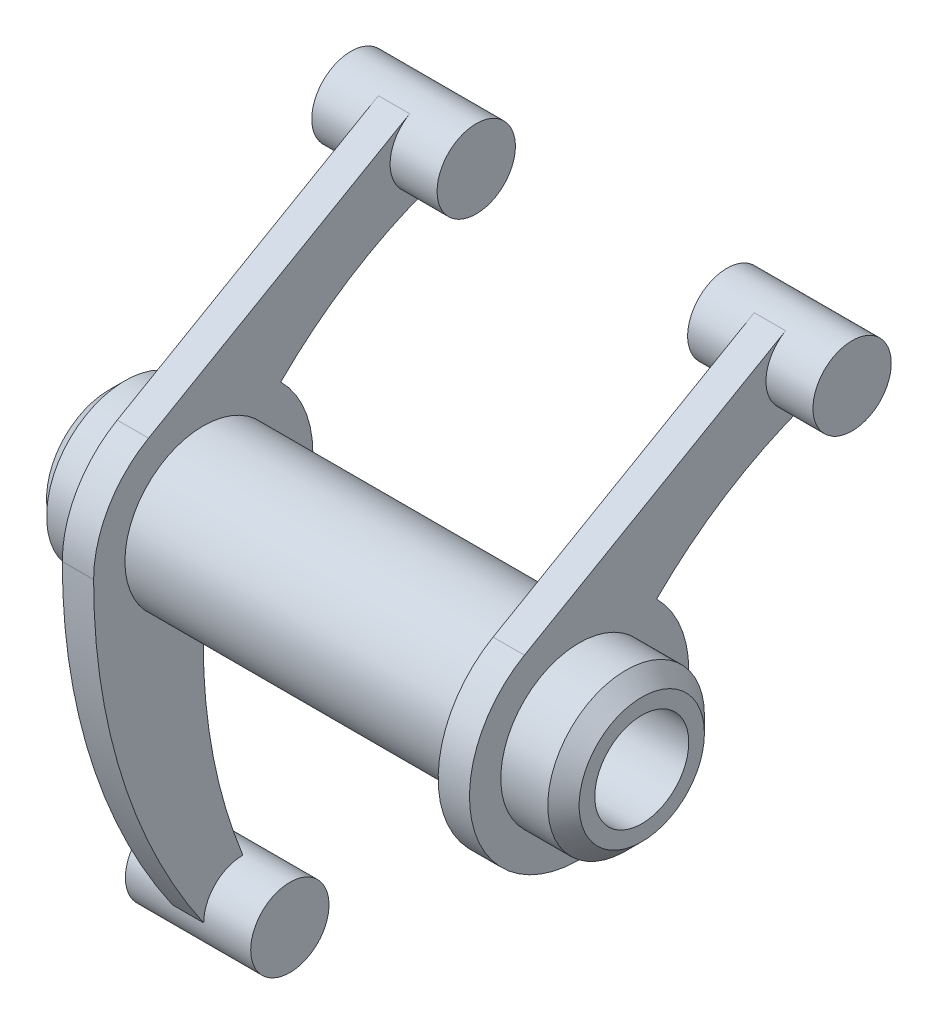
ISO-10303-21;
HEADER;
FILE_DESCRIPTION(('STEP AP214'),'2;1');
FILE_NAME('part.step','',(''),(''),'','','');
FILE_SCHEMA(('AUTOMOTIVE_DESIGN { 1 0 10303 214 1 1 1 1 }'));
ENDSEC;
DATA;
#1=APPLICATION_CONTEXT('core data for automotive mechanical design processes');
#2=APPLICATION_PROTOCOL_DEFINITION('international standard','automotive_design',2000,#1);
#3=PRODUCT_CONTEXT('',#1,'mechanical');
#4=PRODUCT('Part','Part','',(#3));
#5=PRODUCT_RELATED_PRODUCT_CATEGORY('part','',(#4));
#6=PRODUCT_DEFINITION_FORMATION('','',#4);
#7=PRODUCT_DEFINITION_CONTEXT('part definition',#1,'design');
#8=PRODUCT_DEFINITION('design','',#6,#7);
#9=PRODUCT_DEFINITION_SHAPE('','',#8);
#10=(LENGTH_UNIT() NAMED_UNIT(*) SI_UNIT(.MILLI.,.METRE.));
#11=(NAMED_UNIT(*) PLANE_ANGLE_UNIT() SI_UNIT($,.RADIAN.));
#12=(NAMED_UNIT(*) SI_UNIT($,.STERADIAN.) SOLID_ANGLE_UNIT());
#13=UNCERTAINTY_MEASURE_WITH_UNIT(LENGTH_MEASURE(1.E-05),#10,'distance_accuracy_value','');
#14=(GEOMETRIC_REPRESENTATION_CONTEXT(3) GLOBAL_UNCERTAINTY_ASSIGNED_CONTEXT((#13)) GLOBAL_UNIT_ASSIGNED_CONTEXT((#10,
#11,#12)) REPRESENTATION_CONTEXT('',''));
#15=CARTESIAN_POINT('',(0.,0.,0.));
#16=DIRECTION('',(0.,0.,1.));
#17=DIRECTION('',(1.,0.,0.));
#18=AXIS2_PLACEMENT_3D('',#15,#16,#17);
#19=CARTESIAN_POINT('',(-29.,0.,0.));
#20=DIRECTION('',(1.,0.,0.));
#21=DIRECTION('',(0.,0.,-1.));
#22=AXIS2_PLACEMENT_3D('',#19,#20,#21);
#23=CYLINDRICAL_SURFACE('',#22,5.);
#24=CARTESIAN_POINT('',(-1.,0.,0.));
#25=DIRECTION('',(1.,0.,0.));
#26=DIRECTION('',(0.,0.,-1.));
#27=AXIS2_PLACEMENT_3D('',#24,#25,#26);
#28=CIRCLE('',#27,5.);
#29=CARTESIAN_POINT('',(-1.,0.,-5.));
#30=VERTEX_POINT('',#29);
#31=EDGE_CURVE('E217',#30,#30,#28,.T.);
#32=ORIENTED_EDGE('',*,*,#31,.F.);
#33=EDGE_LOOP('',(#32));
#34=FACE_BOUND('',#33,.T.);
#35=CARTESIAN_POINT('',(-23.,0.,0.));
#36=DIRECTION('',(-1.,0.,0.));
#37=DIRECTION('',(0.,0.,1.));
#38=AXIS2_PLACEMENT_3D('',#35,#36,#37);
#39=CIRCLE('',#38,5.);
#40=CARTESIAN_POINT('',(-23.,0.,5.));
#41=VERTEX_POINT('',#40);
#42=EDGE_CURVE('E160',#41,#41,#39,.T.);
#43=ORIENTED_EDGE('',*,*,#42,.F.);
#44=EDGE_LOOP('',(#43));
#45=FACE_BOUND('',#44,.T.);
#46=ADVANCED_FACE('F56',(#34,#45),#23,.T.);
#47=CARTESIAN_POINT('',(4.,13.5,-14.43));
#48=DIRECTION('',(-1.,0.,0.));
#49=DIRECTION('',(0.,0.,1.));
#50=AXIS2_PLACEMENT_3D('',#47,#48,#49);
#51=CYLINDRICAL_SURFACE('',#50,2.5);
#52=CARTESIAN_POINT('',(-4.,13.5,-14.43));
#53=DIRECTION('',(1.,0.,0.));
#54=DIRECTION('',(0.,0.,-1.));
#55=AXIS2_PLACEMENT_3D('',#52,#53,#54);
#56=CIRCLE('',#55,2.5);
#57=CARTESIAN_POINT('',(-4.,13.5,-16.93));
#58=VERTEX_POINT('',#57);
#59=EDGE_CURVE('E251',#58,#58,#56,.T.);
#60=ORIENTED_EDGE('',*,*,#59,.T.);
#61=EDGE_LOOP('',(#60));
#62=FACE_BOUND('',#61,.T.);
#63=CARTESIAN_POINT('',(4.,13.5,-14.43));
#64=DIRECTION('',(1.,0.,0.));
#65=DIRECTION('',(0.,0.,-1.));
#66=AXIS2_PLACEMENT_3D('',#63,#64,#65);
#67=CIRCLE('',#66,2.5);
#68=CARTESIAN_POINT('',(4.,13.5,-16.93));
#69=VERTEX_POINT('',#68);
#70=EDGE_CURVE('E255',#69,#69,#67,.T.);
#71=ORIENTED_EDGE('',*,*,#70,.F.);
#72=EDGE_LOOP('',(#71));
#73=FACE_BOUND('',#72,.T.);
#74=DIRECTION('',(-1.,0.,0.));
#75=VECTOR('',#74,1.);
#76=CARTESIAN_POINT('',(1.,15.6665985248567,-13.1826625027328));
#77=LINE('',#76,#75);
#78=CARTESIAN_POINT('',(1.,15.6665985248567,-13.1826625027328));
#79=VERTEX_POINT('',#78);
#80=CARTESIAN_POINT('',(-1.,15.6665985248567,-13.1826625027328));
#81=VERTEX_POINT('',#80);
#82=EDGE_CURVE('E73',#79,#81,#77,.T.);
#83=ORIENTED_EDGE('',*,*,#82,.F.);
#84=CARTESIAN_POINT('',(1.,13.5,-14.43));
#85=DIRECTION('',(1.,0.,0.));
#86=DIRECTION('',(0.,0.,-1.));
#87=AXIS2_PLACEMENT_3D('',#84,#85,#86);
#88=CIRCLE('',#87,2.5);
#89=CARTESIAN_POINT('',(1.,11.,-14.43));
#90=VERTEX_POINT('',#89);
#91=EDGE_CURVE('E78',#79,#90,#88,.T.);
#92=ORIENTED_EDGE('',*,*,#91,.T.);
#93=DIRECTION('',(-1.,0.,0.));
#94=VECTOR('',#93,1.);
#95=CARTESIAN_POINT('',(1.,11.,-14.43));
#96=LINE('',#95,#94);
#97=CARTESIAN_POINT('',(-1.,11.,-14.43));
#98=VERTEX_POINT('',#97);
#99=EDGE_CURVE('E247',#90,#98,#96,.T.);
#100=ORIENTED_EDGE('',*,*,#99,.T.);
#101=CARTESIAN_POINT('',(-1.,13.5,-14.43));
#102=DIRECTION('',(1.,0.,0.));
#103=DIRECTION('',(0.,0.,-1.));
#104=AXIS2_PLACEMENT_3D('',#101,#102,#103);
#105=CIRCLE('',#104,2.5);
#106=EDGE_CURVE('E241',#81,#98,#105,.T.);
#107=ORIENTED_EDGE('',*,*,#106,.F.);
#108=EDGE_LOOP('',(#83,#92,#100,#107));
#109=FACE_BOUND('',#108,.T.);
#110=ADVANCED_FACE('F282',(#62,#73,#109),#51,.T.);
#111=CARTESIAN_POINT('',(4.,0.,0.));
#112=DIRECTION('',(1.,0.,0.));
#113=DIRECTION('',(0.,0.,-1.));
#114=AXIS2_PLACEMENT_3D('',#111,#112,#113);
#115=PLANE('',#114);
#116=ORIENTED_EDGE('',*,*,#70,.T.);
#117=EDGE_LOOP('',(#116));
#118=FACE_BOUND('',#117,.T.);
#119=ADVANCED_FACE('F291',(#118),#115,.T.);
#120=CARTESIAN_POINT('',(-4.,0.,0.));
#121=DIRECTION('',(1.,0.,0.));
#122=DIRECTION('',(0.,0.,-1.));
#123=AXIS2_PLACEMENT_3D('',#120,#121,#122);
#124=PLANE('',#123);
#125=ORIENTED_EDGE('',*,*,#59,.F.);
#126=EDGE_LOOP('',(#125));
#127=FACE_BOUND('',#126,.T.);
#128=ADVANCED_FACE('F342',(#127),#124,.F.);
#129=CARTESIAN_POINT('',(1.,0.,0.));
#130=DIRECTION('',(-1.,0.,0.));
#131=DIRECTION('',(0.,0.,1.));
#132=AXIS2_PLACEMENT_3D('',#129,#130,#131);
#133=CYLINDRICAL_SURFACE('',#132,7.);
#134=CARTESIAN_POINT('',(-1.,0.,0.));
#135=DIRECTION('',(1.,0.,0.));
#136=DIRECTION('',(0.,0.,-1.));
#137=AXIS2_PLACEMENT_3D('',#134,#135,#136);
#138=CIRCLE('',#137,7.);
#139=CARTESIAN_POINT('',(-1.,6.06647586959877,3.49254499234812));
#140=VERTEX_POINT('',#139);
#141=CARTESIAN_POINT('',(-1.,4.94974746830582,-4.94974746830584));
#142=VERTEX_POINT('',#141);
#143=EDGE_CURVE('E222',#140,#142,#138,.T.);
#144=ORIENTED_EDGE('',*,*,#143,.T.);
#145=DIRECTION('',(-1.,0.,0.));
#146=VECTOR('',#145,1.);
#147=CARTESIAN_POINT('',(1.,4.94974746830582,-4.94974746830584));
#148=LINE('',#147,#146);
#149=CARTESIAN_POINT('',(1.,4.94974746830582,-4.94974746830584));
#150=VERTEX_POINT('',#149);
#151=EDGE_CURVE('E249',#150,#142,#148,.T.);
#152=ORIENTED_EDGE('',*,*,#151,.F.);
#153=CARTESIAN_POINT('',(1.,0.,0.));
#154=DIRECTION('',(1.,0.,0.));
#155=DIRECTION('',(0.,0.,-1.));
#156=AXIS2_PLACEMENT_3D('',#153,#154,#155);
#157=CIRCLE('',#156,7.);
#158=CARTESIAN_POINT('',(1.,6.06647586959877,3.49254499234812));
#159=VERTEX_POINT('',#158);
#160=EDGE_CURVE('E223',#159,#150,#157,.T.);
#161=ORIENTED_EDGE('',*,*,#160,.F.);
#162=DIRECTION('',(-1.,0.,0.));
#163=VECTOR('',#162,1.);
#164=CARTESIAN_POINT('',(1.,6.06647586959877,3.49254499234812));
#165=LINE('',#164,#163);
#166=EDGE_CURVE('E235',#159,#140,#165,.T.);
#167=ORIENTED_EDGE('',*,*,#166,.T.);
#168=EDGE_LOOP('',(#144,#152,#161,#167));
#169=FACE_BOUND('',#168,.T.);
#170=ADVANCED_FACE('F323',(#169),#133,.T.);
#171=CARTESIAN_POINT('',(1.,-13.5010953991257,-23.395736123874));
#172=DIRECTION('',(-1.,0.,0.));
#173=DIRECTION('',(0.,0.,1.));
#174=AXIS2_PLACEMENT_3D('',#171,#172,#173);
#175=CYLINDRICAL_SURFACE('',#174,26.09);
#176=CARTESIAN_POINT('',(-1.,-13.5010953991257,-23.395736123874));
#177=DIRECTION('',(1.,0.,0.));
#178=DIRECTION('',(0.,0.,-1.));
#179=AXIS2_PLACEMENT_3D('',#176,#177,#178);
#180=CIRCLE('',#179,26.09);
#181=EDGE_CURVE('E236',#142,#98,#180,.F.);
#182=ORIENTED_EDGE('',*,*,#181,.T.);
#183=ORIENTED_EDGE('',*,*,#99,.F.);
#184=CARTESIAN_POINT('',(1.,-13.5010953991257,-23.395736123874));
#185=DIRECTION('',(1.,0.,0.));
#186=DIRECTION('',(0.,0.,-1.));
#187=AXIS2_PLACEMENT_3D('',#184,#185,#186);
#188=CIRCLE('',#187,26.09);
#189=EDGE_CURVE('E228',#150,#90,#188,.F.);
#190=ORIENTED_EDGE('',*,*,#189,.F.);
#191=ORIENTED_EDGE('',*,*,#151,.T.);
#192=EDGE_LOOP('',(#182,#183,#190,#191));
#193=FACE_BOUND('',#192,.T.);
#194=ADVANCED_FACE('F326',(#193),#175,.F.);
#195=CARTESIAN_POINT('',(1.,6.06647586959877,3.49254499234812));
#196=DIRECTION('',(0.,0.866639409942681,0.498934998906874));
#197=DIRECTION('',(0.,-0.498934998906874,0.866639409942681));
#198=AXIS2_PLACEMENT_3D('',#195,#196,#197);
#199=PLANE('',#198);
#200=DIRECTION('',(0.,0.498934998906874,-0.866639409942681));
#201=VECTOR('',#200,1.);
#202=CARTESIAN_POINT('',(-1.,6.06647586959877,3.49254499234812));
#203=LINE('',#202,#201);
#204=EDGE_CURVE('E226',#140,#81,#203,.T.);
#205=ORIENTED_EDGE('',*,*,#204,.F.);
#206=ORIENTED_EDGE('',*,*,#166,.F.);
#207=DIRECTION('',(0.,0.498934998906874,-0.866639409942681));
#208=VECTOR('',#207,1.);
#209=CARTESIAN_POINT('',(1.,6.06647586959877,3.49254499234812));
#210=LINE('',#209,#208);
#211=EDGE_CURVE('E232',#159,#79,#210,.T.);
#212=ORIENTED_EDGE('',*,*,#211,.T.);
#213=ORIENTED_EDGE('',*,*,#82,.T.);
#214=EDGE_LOOP('',(#205,#206,#212,#213));
#215=FACE_BOUND('',#214,.T.);
#216=ADVANCED_FACE('F320',(#215),#199,.T.);
#217=CARTESIAN_POINT('',(1.,0.,0.));
#218=DIRECTION('',(1.,0.,0.));
#219=DIRECTION('',(0.,0.,-1.));
#220=AXIS2_PLACEMENT_3D('',#217,#218,#219);
#221=PLANE('',#220);
#222=CARTESIAN_POINT('',(1.,0.,0.));
#223=DIRECTION('',(1.,0.,0.));
#224=DIRECTION('',(0.,0.,-1.));
#225=AXIS2_PLACEMENT_3D('',#222,#223,#224);
#226=CIRCLE('',#225,5.);
#227=CARTESIAN_POINT('',(1.,0.,-5.));
#228=VERTEX_POINT('',#227);
#229=EDGE_CURVE('E225',#228,#228,#226,.T.);
#230=ORIENTED_EDGE('',*,*,#229,.F.);
#231=EDGE_LOOP('',(#230));
#232=FACE_BOUND('',#231,.T.);
#233=ORIENTED_EDGE('',*,*,#160,.T.);
#234=ORIENTED_EDGE('',*,*,#189,.T.);
#235=ORIENTED_EDGE('',*,*,#91,.F.);
#236=ORIENTED_EDGE('',*,*,#211,.F.);
#237=EDGE_LOOP('',(#233,#234,#235,#236));
#238=FACE_BOUND('',#237,.T.);
#239=ADVANCED_FACE('F314',(#232,#238),#221,.T.);
#240=CARTESIAN_POINT('',(-1.,0.,0.));
#241=DIRECTION('',(1.,0.,0.));
#242=DIRECTION('',(0.,0.,-1.));
#243=AXIS2_PLACEMENT_3D('',#240,#241,#242);
#244=PLANE('',#243);
#245=ORIENTED_EDGE('',*,*,#31,.T.);
#246=EDGE_LOOP('',(#245));
#247=FACE_BOUND('',#246,.T.);
#248=ORIENTED_EDGE('',*,*,#143,.F.);
#249=ORIENTED_EDGE('',*,*,#204,.T.);
#250=ORIENTED_EDGE('',*,*,#106,.T.);
#251=ORIENTED_EDGE('',*,*,#181,.F.);
#252=EDGE_LOOP('',(#248,#249,#250,#251));
#253=FACE_BOUND('',#252,.T.);
#254=ADVANCED_FACE('F301',(#247,#253),#244,.F.);
#255=CARTESIAN_POINT('',(-28.,0.,0.));
#256=DIRECTION('',(1.,0.,0.));
#257=DIRECTION('',(0.,0.,-1.));
#258=AXIS2_PLACEMENT_3D('',#255,#256,#257);
#259=CIRCLE('',#258,5.);
#260=CARTESIAN_POINT('',(-28.,0.,-5.));
#261=VERTEX_POINT('',#260);
#262=EDGE_CURVE('E265',#261,#261,#259,.T.);
#263=ORIENTED_EDGE('',*,*,#262,.T.);
#264=EDGE_LOOP('',(#263));
#265=FACE_BOUND('',#264,.T.);
#266=CARTESIAN_POINT('',(-25.,0.,0.));
#267=DIRECTION('',(-1.,0.,0.));
#268=DIRECTION('',(0.,0.,1.));
#269=AXIS2_PLACEMENT_3D('',#266,#267,#268);
#270=CIRCLE('',#269,5.);
#271=CARTESIAN_POINT('',(-25.,0.,5.));
#272=VERTEX_POINT('',#271);
#273=EDGE_CURVE('E260',#272,#272,#270,.F.);
#274=ORIENTED_EDGE('',*,*,#273,.F.);
#275=EDGE_LOOP('',(#274));
#276=FACE_BOUND('',#275,.T.);
#277=ADVANCED_FACE('F286',(#265,#276),#23,.T.);
#278=CARTESIAN_POINT('',(3.99999999999999,0.,0.));
#279=DIRECTION('',(1.,0.,0.));
#280=DIRECTION('',(0.,0.,-1.));
#281=AXIS2_PLACEMENT_3D('',#278,#279,#280);
#282=CIRCLE('',#281,5.);
#283=CARTESIAN_POINT('',(3.99999999999999,0.,-5.));
#284=VERTEX_POINT('',#283);
#285=EDGE_CURVE('E12',#284,#284,#282,.F.);
#286=ORIENTED_EDGE('',*,*,#285,.T.);
#287=EDGE_LOOP('',(#286));
#288=FACE_BOUND('',#287,.T.);
#289=ORIENTED_EDGE('',*,*,#229,.T.);
#290=EDGE_LOOP('',(#289));
#291=FACE_BOUND('',#290,.T.);
#292=ADVANCED_FACE('F287',(#288,#291),#23,.T.);
#293=CARTESIAN_POINT('',(-29.,0.,0.));
#294=DIRECTION('',(1.,0.,0.));
#295=DIRECTION('',(0.,0.,-1.));
#296=AXIS2_PLACEMENT_3D('',#293,#294,#295);
#297=PLANE('',#296);
#298=CARTESIAN_POINT('',(-29.,0.,0.));
#299=DIRECTION('',(1.,0.,0.));
#300=DIRECTION('',(0.,0.,-1.));
#301=AXIS2_PLACEMENT_3D('',#298,#299,#300);
#302=CIRCLE('',#301,3.99999999999998);
#303=CARTESIAN_POINT('',(-29.,0.,-3.99999999999998));
#304=VERTEX_POINT('',#303);
#305=EDGE_CURVE('E264',#304,#304,#302,.F.);
#306=ORIENTED_EDGE('',*,*,#305,.T.);
#307=EDGE_LOOP('',(#306));
#308=FACE_BOUND('',#307,.T.);
#309=CARTESIAN_POINT('',(-29.,0.,0.));
#310=DIRECTION('',(1.,0.,0.));
#311=DIRECTION('',(0.,0.,-1.));
#312=AXIS2_PLACEMENT_3D('',#309,#310,#311);
#313=CIRCLE('',#312,3.);
#314=CARTESIAN_POINT('',(-29.,0.,-3.));
#315=VERTEX_POINT('',#314);
#316=EDGE_CURVE('E214',#315,#315,#313,.T.);
#317=ORIENTED_EDGE('',*,*,#316,.T.);
#318=EDGE_LOOP('',(#317));
#319=FACE_BOUND('',#318,.T.);
#320=ADVANCED_FACE('F303',(#308,#319),#297,.F.);
#321=CARTESIAN_POINT('',(-29.,0.,0.));
#322=DIRECTION('',(1.,0.,0.));
#323=DIRECTION('',(0.,0.,-1.));
#324=AXIS2_PLACEMENT_3D('',#321,#322,#323);
#325=CYLINDRICAL_SURFACE('',#324,3.);
#326=ORIENTED_EDGE('',*,*,#316,.F.);
#327=EDGE_LOOP('',(#326));
#328=FACE_BOUND('',#327,.T.);
#329=CARTESIAN_POINT('',(5.,0.,0.));
#330=DIRECTION('',(1.,0.,0.));
#331=DIRECTION('',(0.,0.,-1.));
#332=AXIS2_PLACEMENT_3D('',#329,#330,#331);
#333=CIRCLE('',#332,3.);
#334=CARTESIAN_POINT('',(5.,0.,-3.));
#335=VERTEX_POINT('',#334);
#336=EDGE_CURVE('E215',#335,#335,#333,.T.);
#337=ORIENTED_EDGE('',*,*,#336,.T.);
#338=EDGE_LOOP('',(#337));
#339=FACE_BOUND('',#338,.T.);
#340=ADVANCED_FACE('F310',(#328,#339),#325,.F.);
#341=CARTESIAN_POINT('',(5.,0.,0.));
#342=DIRECTION('',(1.,0.,0.));
#343=DIRECTION('',(0.,0.,-1.));
#344=AXIS2_PLACEMENT_3D('',#341,#342,#343);
#345=PLANE('',#344);
#346=CARTESIAN_POINT('',(5.,0.,0.));
#347=DIRECTION('',(1.,0.,0.));
#348=DIRECTION('',(0.,0.,-1.));
#349=AXIS2_PLACEMENT_3D('',#346,#347,#348);
#350=CIRCLE('',#349,4.);
#351=CARTESIAN_POINT('',(5.,0.,-4.));
#352=VERTEX_POINT('',#351);
#353=EDGE_CURVE('E69',#352,#352,#350,.T.);
#354=ORIENTED_EDGE('',*,*,#353,.T.);
#355=EDGE_LOOP('',(#354));
#356=FACE_BOUND('',#355,.T.);
#357=ORIENTED_EDGE('',*,*,#336,.F.);
#358=EDGE_LOOP('',(#357));
#359=FACE_BOUND('',#358,.T.);
#360=ADVANCED_FACE('F269',(#356,#359),#345,.T.);
#361=CARTESIAN_POINT('',(-25.,-13.5010953991257,-23.395736123874));
#362=DIRECTION('',(1.,0.,0.));
#363=DIRECTION('',(0.,0.,-1.));
#364=AXIS2_PLACEMENT_3D('',#361,#362,#363);
#365=CYLINDRICAL_SURFACE('',#364,26.09);
#366=CARTESIAN_POINT('',(-23.,-13.5010953991257,-23.395736123874));
#367=DIRECTION('',(-1.,0.,0.));
#368=DIRECTION('',(0.,0.,1.));
#369=AXIS2_PLACEMENT_3D('',#366,#367,#368);
#370=CIRCLE('',#369,26.09);
#371=CARTESIAN_POINT('',(-23.,4.94974746830582,-4.94974746830584));
#372=VERTEX_POINT('',#371);
#373=CARTESIAN_POINT('',(-23.,11.,-14.4299999999999));
#374=VERTEX_POINT('',#373);
#375=EDGE_CURVE('E162',#372,#374,#370,.T.);
#376=ORIENTED_EDGE('',*,*,#375,.F.);
#377=DIRECTION('',(1.,0.,0.));
#378=VECTOR('',#377,1.);
#379=CARTESIAN_POINT('',(-25.,4.94974746830582,-4.94974746830584));
#380=LINE('',#379,#378);
#381=CARTESIAN_POINT('',(-25.,4.94974746830582,-4.94974746830584));
#382=VERTEX_POINT('',#381);
#383=EDGE_CURVE('E209',#382,#372,#380,.T.);
#384=ORIENTED_EDGE('',*,*,#383,.F.);
#385=CARTESIAN_POINT('',(-25.,-13.5010953991257,-23.395736123874));
#386=DIRECTION('',(-1.,0.,0.));
#387=DIRECTION('',(0.,0.,1.));
#388=AXIS2_PLACEMENT_3D('',#385,#386,#387);
#389=CIRCLE('',#388,26.09);
#390=CARTESIAN_POINT('',(-25.,11.,-14.43));
#391=VERTEX_POINT('',#390);
#392=EDGE_CURVE('E164',#382,#391,#389,.T.);
#393=ORIENTED_EDGE('',*,*,#392,.T.);
#394=DIRECTION('',(1.,0.,0.));
#395=VECTOR('',#394,1.);
#396=CARTESIAN_POINT('',(-25.,11.,-14.43));
#397=LINE('',#396,#395);
#398=EDGE_CURVE('E149',#391,#374,#397,.T.);
#399=ORIENTED_EDGE('',*,*,#398,.T.);
#400=EDGE_LOOP('',(#376,#384,#393,#399));
#401=FACE_BOUND('',#400,.T.);
#402=ADVANCED_FACE('F165',(#401),#365,.F.);
#403=CARTESIAN_POINT('',(-25.,0.,0.));
#404=DIRECTION('',(1.,0.,0.));
#405=DIRECTION('',(0.,0.,-1.));
#406=AXIS2_PLACEMENT_3D('',#403,#404,#405);
#407=CYLINDRICAL_SURFACE('',#406,7.);
#408=CARTESIAN_POINT('',(-23.,0.,0.));
#409=DIRECTION('',(-1.,0.,0.));
#410=DIRECTION('',(0.,0.,1.));
#411=AXIS2_PLACEMENT_3D('',#408,#409,#410);
#412=CIRCLE('',#411,7.);
#413=CARTESIAN_POINT('',(-23.,-7.,0.));
#414=VERTEX_POINT('',#413);
#415=EDGE_CURVE('E172',#372,#414,#412,.T.);
#416=ORIENTED_EDGE('',*,*,#415,.T.);
#417=DIRECTION('',(1.,0.,0.));
#418=VECTOR('',#417,1.);
#419=CARTESIAN_POINT('',(-25.,-7.,0.));
#420=LINE('',#419,#418);
#421=CARTESIAN_POINT('',(-25.,-7.,0.));
#422=VERTEX_POINT('',#421);
#423=EDGE_CURVE('E210',#422,#414,#420,.T.);
#424=ORIENTED_EDGE('',*,*,#423,.F.);
#425=CARTESIAN_POINT('',(-25.,0.,0.));
#426=DIRECTION('',(-1.,0.,0.));
#427=DIRECTION('',(0.,0.,1.));
#428=AXIS2_PLACEMENT_3D('',#425,#426,#427);
#429=CIRCLE('',#428,7.);
#430=EDGE_CURVE('E586',#382,#422,#429,.T.);
#431=ORIENTED_EDGE('',*,*,#430,.F.);
#432=ORIENTED_EDGE('',*,*,#383,.T.);
#433=EDGE_LOOP('',(#416,#424,#431,#432));
#434=FACE_BOUND('',#433,.T.);
#435=ADVANCED_FACE('F434',(#434),#407,.T.);
#436=CARTESIAN_POINT('',(-25.,-7.00081923265346,-34.6599999903182));
#437=DIRECTION('',(1.,0.,0.));
#438=DIRECTION('',(0.,0.,-1.));
#439=AXIS2_PLACEMENT_3D('',#436,#437,#438);
#440=CYLINDRICAL_SURFACE('',#439,34.66);
#441=CARTESIAN_POINT('',(-23.,-7.00081923265346,-34.6599999903182));
#442=DIRECTION('',(-1.,0.,0.));
#443=DIRECTION('',(0.,0.,1.));
#444=AXIS2_PLACEMENT_3D('',#441,#442,#443);
#445=CIRCLE('',#444,34.66);
#446=CARTESIAN_POINT('',(-23.,-20.,-2.53));
#447=VERTEX_POINT('',#446);
#448=EDGE_CURVE('E176',#414,#447,#445,.F.);
#449=ORIENTED_EDGE('',*,*,#448,.T.);
#450=DIRECTION('',(1.,0.,0.));
#451=VECTOR('',#450,1.);
#452=CARTESIAN_POINT('',(-25.,-20.,-2.53));
#453=LINE('',#452,#451);
#454=CARTESIAN_POINT('',(-25.,-20.,-2.53));
#455=VERTEX_POINT('',#454);
#456=EDGE_CURVE('E202',#455,#447,#453,.T.);
#457=ORIENTED_EDGE('',*,*,#456,.F.);
#458=CARTESIAN_POINT('',(-25.,-7.00081923265346,-34.6599999903182));
#459=DIRECTION('',(-1.,0.,0.));
#460=DIRECTION('',(0.,0.,1.));
#461=AXIS2_PLACEMENT_3D('',#458,#459,#460);
#462=CIRCLE('',#461,34.66);
#463=EDGE_CURVE('E587',#422,#455,#462,.F.);
#464=ORIENTED_EDGE('',*,*,#463,.F.);
#465=ORIENTED_EDGE('',*,*,#423,.T.);
#466=EDGE_LOOP('',(#449,#457,#464,#465));
#467=FACE_BOUND('',#466,.T.);
#468=ADVANCED_FACE('F443',(#467),#440,.F.);
#469=CARTESIAN_POINT('',(-25.,-0.000437777781714681,-32.5199999970534));
#470=DIRECTION('',(1.,0.,0.));
#471=DIRECTION('',(0.,0.,-1.));
#472=AXIS2_PLACEMENT_3D('',#469,#470,#471);
#473=CYLINDRICAL_SURFACE('',#472,39.52);
#474=CARTESIAN_POINT('',(-23.,-0.000437777781714681,-32.5199999970534));
#475=DIRECTION('',(-1.,0.,0.));
#476=DIRECTION('',(0.,0.,1.));
#477=AXIS2_PLACEMENT_3D('',#474,#475,#476);
#478=CIRCLE('',#477,39.52);
#479=CARTESIAN_POINT('',(-23.,-22.5000000000001,-0.0300000000000508));
#480=VERTEX_POINT('',#479);
#481=CARTESIAN_POINT('',(-23.,9.42326098401834E-05,6.99999999936573));
#482=VERTEX_POINT('',#481);
#483=EDGE_CURVE('E189',#480,#482,#478,.T.);
#484=ORIENTED_EDGE('',*,*,#483,.T.);
#485=DIRECTION('',(1.,0.,0.));
#486=VECTOR('',#485,1.);
#487=CARTESIAN_POINT('',(-25.,9.42326098401834E-05,6.99999999936573));
#488=LINE('',#487,#486);
#489=CARTESIAN_POINT('',(-25.,9.42326098401834E-05,6.99999999936573));
#490=VERTEX_POINT('',#489);
#491=EDGE_CURVE('E200',#490,#482,#488,.T.);
#492=ORIENTED_EDGE('',*,*,#491,.F.);
#493=CARTESIAN_POINT('',(-25.,-0.000437777781714681,-32.5199999970534));
#494=DIRECTION('',(-1.,0.,0.));
#495=DIRECTION('',(0.,0.,1.));
#496=AXIS2_PLACEMENT_3D('',#493,#494,#495);
#497=CIRCLE('',#496,39.52);
#498=CARTESIAN_POINT('',(-25.,-22.5,-0.0300000000000005));
#499=VERTEX_POINT('',#498);
#500=EDGE_CURVE('E596',#499,#490,#497,.T.);
#501=ORIENTED_EDGE('',*,*,#500,.F.);
#502=DIRECTION('',(1.,0.,0.));
#503=VECTOR('',#502,1.);
#504=CARTESIAN_POINT('',(-25.,-22.5,-0.0300000000000005));
#505=LINE('',#504,#503);
#506=EDGE_CURVE('E205',#499,#480,#505,.T.);
#507=ORIENTED_EDGE('',*,*,#506,.T.);
#508=EDGE_LOOP('',(#484,#492,#501,#507));
#509=FACE_BOUND('',#508,.T.);
#510=ADVANCED_FACE('F455',(#509),#473,.T.);
#511=CARTESIAN_POINT('',(-23.,6.06647586959877,3.49254499234812));
#512=VERTEX_POINT('',#511);
#513=EDGE_CURVE('E179',#482,#512,#412,.T.);
#514=ORIENTED_EDGE('',*,*,#513,.T.);
#515=DIRECTION('',(1.,0.,0.));
#516=VECTOR('',#515,1.);
#517=CARTESIAN_POINT('',(-25.,6.06647586959877,3.49254499234812));
#518=LINE('',#517,#516);
#519=CARTESIAN_POINT('',(-25.,6.06647586959877,3.49254499234812));
#520=VERTEX_POINT('',#519);
#521=EDGE_CURVE('E198',#520,#512,#518,.T.);
#522=ORIENTED_EDGE('',*,*,#521,.F.);
#523=EDGE_CURVE('E591',#490,#520,#429,.T.);
#524=ORIENTED_EDGE('',*,*,#523,.F.);
#525=ORIENTED_EDGE('',*,*,#491,.T.);
#526=EDGE_LOOP('',(#514,#522,#524,#525));
#527=FACE_BOUND('',#526,.T.);
#528=ADVANCED_FACE('F447',(#527),#407,.T.);
#529=CARTESIAN_POINT('',(-25.,6.06647586959877,3.49254499234812));
#530=DIRECTION('',(0.,-0.866639409942681,-0.498934998906874));
#531=DIRECTION('',(0.,0.498934998906874,-0.866639409942681));
#532=AXIS2_PLACEMENT_3D('',#529,#530,#531);
#533=PLANE('',#532);
#534=DIRECTION('',(0.,0.498934998906874,-0.866639409942681));
#535=VECTOR('',#534,1.);
#536=CARTESIAN_POINT('',(-23.,6.06647586959877,3.49254499234812));
#537=LINE('',#536,#535);
#538=CARTESIAN_POINT('',(-23.,15.6665985248567,-13.1826625027328));
#539=VERTEX_POINT('',#538);
#540=EDGE_CURVE('E158',#512,#539,#537,.T.);
#541=ORIENTED_EDGE('',*,*,#540,.T.);
#542=DIRECTION('',(1.,0.,0.));
#543=VECTOR('',#542,1.);
#544=CARTESIAN_POINT('',(-25.,15.6665985248567,-13.1826625027328));
#545=LINE('',#544,#543);
#546=CARTESIAN_POINT('',(-25.,15.6665985248567,-13.1826625027328));
#547=VERTEX_POINT('',#546);
#548=EDGE_CURVE('E155',#547,#539,#545,.T.);
#549=ORIENTED_EDGE('',*,*,#548,.F.);
#550=DIRECTION('',(0.,0.498934998906874,-0.866639409942681));
#551=VECTOR('',#550,1.);
#552=CARTESIAN_POINT('',(-25.,6.06647586959877,3.49254499234812));
#553=LINE('',#552,#551);
#554=EDGE_CURVE('E600',#520,#547,#553,.T.);
#555=ORIENTED_EDGE('',*,*,#554,.F.);
#556=ORIENTED_EDGE('',*,*,#521,.T.);
#557=EDGE_LOOP('',(#541,#549,#555,#556));
#558=FACE_BOUND('',#557,.T.);
#559=ADVANCED_FACE('F475',(#558),#533,.F.);
#560=CARTESIAN_POINT('',(-25.,0.,0.));
#561=DIRECTION('',(-1.,0.,0.));
#562=DIRECTION('',(0.,0.,1.));
#563=AXIS2_PLACEMENT_3D('',#560,#561,#562);
#564=PLANE('',#563);
#565=ORIENTED_EDGE('',*,*,#392,.F.);
#566=ORIENTED_EDGE('',*,*,#430,.T.);
#567=ORIENTED_EDGE('',*,*,#463,.T.);
#568=CARTESIAN_POINT('',(-25.,-22.5,-2.53));
#569=DIRECTION('',(-1.,0.,0.));
#570=DIRECTION('',(0.,0.,1.));
#571=AXIS2_PLACEMENT_3D('',#568,#569,#570);
#572=CIRCLE('',#571,2.5);
#573=EDGE_CURVE('E592',#499,#455,#572,.T.);
#574=ORIENTED_EDGE('',*,*,#573,.F.);
#575=ORIENTED_EDGE('',*,*,#500,.T.);
#576=ORIENTED_EDGE('',*,*,#523,.T.);
#577=ORIENTED_EDGE('',*,*,#554,.T.);
#578=CARTESIAN_POINT('',(-25.,13.5,-14.43));
#579=DIRECTION('',(-1.,0.,0.));
#580=DIRECTION('',(0.,0.,1.));
#581=AXIS2_PLACEMENT_3D('',#578,#579,#580);
#582=CIRCLE('',#581,2.5);
#583=EDGE_CURVE('E170',#391,#547,#582,.T.);
#584=ORIENTED_EDGE('',*,*,#583,.F.);
#585=EDGE_LOOP('',(#565,#566,#567,#574,#575,#576,#577,#584));
#586=FACE_BOUND('',#585,.T.);
#587=ORIENTED_EDGE('',*,*,#273,.T.);
#588=EDGE_LOOP('',(#587));
#589=FACE_BOUND('',#588,.T.);
#590=ADVANCED_FACE('F485',(#586,#589),#564,.T.);
#591=CARTESIAN_POINT('',(-23.,0.,0.));
#592=DIRECTION('',(-1.,0.,0.));
#593=DIRECTION('',(0.,0.,1.));
#594=AXIS2_PLACEMENT_3D('',#591,#592,#593);
#595=PLANE('',#594);
#596=ORIENTED_EDGE('',*,*,#375,.T.);
#597=CARTESIAN_POINT('',(-23.,13.5,-14.43));
#598=DIRECTION('',(-1.,0.,0.));
#599=DIRECTION('',(0.,0.,1.));
#600=AXIS2_PLACEMENT_3D('',#597,#598,#599);
#601=CIRCLE('',#600,2.5);
#602=EDGE_CURVE('E148',#374,#539,#601,.T.);
#603=ORIENTED_EDGE('',*,*,#602,.T.);
#604=ORIENTED_EDGE('',*,*,#540,.F.);
#605=ORIENTED_EDGE('',*,*,#513,.F.);
#606=ORIENTED_EDGE('',*,*,#483,.F.);
#607=CARTESIAN_POINT('',(-23.,-22.5,-2.53));
#608=DIRECTION('',(-1.,0.,0.));
#609=DIRECTION('',(0.,0.,1.));
#610=AXIS2_PLACEMENT_3D('',#607,#608,#609);
#611=CIRCLE('',#610,2.5);
#612=EDGE_CURVE('E190',#480,#447,#611,.T.);
#613=ORIENTED_EDGE('',*,*,#612,.T.);
#614=ORIENTED_EDGE('',*,*,#448,.F.);
#615=ORIENTED_EDGE('',*,*,#415,.F.);
#616=EDGE_LOOP('',(#596,#603,#604,#605,#606,#613,#614,#615));
#617=FACE_BOUND('',#616,.T.);
#618=ORIENTED_EDGE('',*,*,#42,.T.);
#619=EDGE_LOOP('',(#618));
#620=FACE_BOUND('',#619,.T.);
#621=ADVANCED_FACE('F168',(#617,#620),#595,.F.);
#622=CARTESIAN_POINT('',(-20.,13.5,-14.43));
#623=DIRECTION('',(-1.,0.,0.));
#624=DIRECTION('',(0.,0.,1.));
#625=AXIS2_PLACEMENT_3D('',#622,#623,#624);
#626=CYLINDRICAL_SURFACE('',#625,2.5);
#627=CARTESIAN_POINT('',(-28.,13.5,-14.43));
#628=DIRECTION('',(-1.,0.,0.));
#629=DIRECTION('',(0.,0.,1.));
#630=AXIS2_PLACEMENT_3D('',#627,#628,#629);
#631=CIRCLE('',#630,2.5);
#632=CARTESIAN_POINT('',(-28.,13.5,-11.93));
#633=VERTEX_POINT('',#632);
#634=EDGE_CURVE('E582',#633,#633,#631,.T.);
#635=ORIENTED_EDGE('',*,*,#634,.F.);
#636=EDGE_LOOP('',(#635));
#637=FACE_BOUND('',#636,.T.);
#638=CARTESIAN_POINT('',(-20.,13.5,-14.43));
#639=DIRECTION('',(-1.,0.,0.));
#640=DIRECTION('',(0.,0.,1.));
#641=AXIS2_PLACEMENT_3D('',#638,#639,#640);
#642=CIRCLE('',#641,2.5);
#643=CARTESIAN_POINT('',(-20.,13.5,-11.93));
#644=VERTEX_POINT('',#643);
#645=EDGE_CURVE('E578',#644,#644,#642,.T.);
#646=ORIENTED_EDGE('',*,*,#645,.T.);
#647=EDGE_LOOP('',(#646));
#648=FACE_BOUND('',#647,.T.);
#649=ORIENTED_EDGE('',*,*,#398,.F.);
#650=ORIENTED_EDGE('',*,*,#583,.T.);
#651=ORIENTED_EDGE('',*,*,#548,.T.);
#652=ORIENTED_EDGE('',*,*,#602,.F.);
#653=EDGE_LOOP('',(#649,#650,#651,#652));
#654=FACE_BOUND('',#653,.T.);
#655=ADVANCED_FACE('F146',(#637,#648,#654),#626,.T.);
#656=CARTESIAN_POINT('',(-20.,0.,0.));
#657=DIRECTION('',(-1.,0.,0.));
#658=DIRECTION('',(0.,0.,1.));
#659=AXIS2_PLACEMENT_3D('',#656,#657,#658);
#660=PLANE('',#659);
#661=ORIENTED_EDGE('',*,*,#645,.F.);
#662=EDGE_LOOP('',(#661));
#663=FACE_BOUND('',#662,.T.);
#664=ADVANCED_FACE('F513',(#663),#660,.F.);
#665=CARTESIAN_POINT('',(-28.,0.,0.));
#666=DIRECTION('',(-1.,0.,0.));
#667=DIRECTION('',(0.,0.,1.));
#668=AXIS2_PLACEMENT_3D('',#665,#666,#667);
#669=PLANE('',#668);
#670=ORIENTED_EDGE('',*,*,#634,.T.);
#671=EDGE_LOOP('',(#670));
#672=FACE_BOUND('',#671,.T.);
#673=ADVANCED_FACE('F524',(#672),#669,.T.);
#674=CARTESIAN_POINT('',(-20.,-22.5,-2.53));
#675=DIRECTION('',(-1.,0.,0.));
#676=DIRECTION('',(0.,0.,1.));
#677=AXIS2_PLACEMENT_3D('',#674,#675,#676);
#678=CYLINDRICAL_SURFACE('',#677,2.5);
#679=ORIENTED_EDGE('',*,*,#506,.F.);
#680=ORIENTED_EDGE('',*,*,#573,.T.);
#681=ORIENTED_EDGE('',*,*,#456,.T.);
#682=ORIENTED_EDGE('',*,*,#612,.F.);
#683=EDGE_LOOP('',(#679,#680,#681,#682));
#684=FACE_BOUND('',#683,.T.);
#685=CARTESIAN_POINT('',(-20.,-22.5,-2.53));
#686=DIRECTION('',(-1.,0.,0.));
#687=DIRECTION('',(0.,0.,1.));
#688=AXIS2_PLACEMENT_3D('',#685,#686,#687);
#689=CIRCLE('',#688,2.5);
#690=CARTESIAN_POINT('',(-20.,-22.5,-0.0300000000000005));
#691=VERTEX_POINT('',#690);
#692=EDGE_CURVE('E173',#691,#691,#689,.T.);
#693=ORIENTED_EDGE('',*,*,#692,.T.);
#694=EDGE_LOOP('',(#693));
#695=FACE_BOUND('',#694,.T.);
#696=CARTESIAN_POINT('',(-28.,-22.5,-2.53));
#697=DIRECTION('',(-1.,0.,0.));
#698=DIRECTION('',(0.,0.,1.));
#699=AXIS2_PLACEMENT_3D('',#696,#697,#698);
#700=CIRCLE('',#699,2.5);
#701=CARTESIAN_POINT('',(-28.,-22.5,-0.0300000000000005));
#702=VERTEX_POINT('',#701);
#703=EDGE_CURVE('E180',#702,#702,#700,.T.);
#704=ORIENTED_EDGE('',*,*,#703,.F.);
#705=EDGE_LOOP('',(#704));
#706=FACE_BOUND('',#705,.T.);
#707=ADVANCED_FACE('F532',(#684,#695,#706),#678,.T.);
#708=CARTESIAN_POINT('',(-20.,0.,0.));
#709=DIRECTION('',(-1.,0.,0.));
#710=DIRECTION('',(0.,0.,1.));
#711=AXIS2_PLACEMENT_3D('',#708,#709,#710);
#712=PLANE('',#711);
#713=ORIENTED_EDGE('',*,*,#692,.F.);
#714=EDGE_LOOP('',(#713));
#715=FACE_BOUND('',#714,.T.);
#716=ADVANCED_FACE('F544',(#715),#712,.F.);
#717=CARTESIAN_POINT('',(-28.,0.,0.));
#718=DIRECTION('',(-1.,0.,0.));
#719=DIRECTION('',(0.,0.,1.));
#720=AXIS2_PLACEMENT_3D('',#717,#718,#719);
#721=PLANE('',#720);
#722=ORIENTED_EDGE('',*,*,#703,.T.);
#723=EDGE_LOOP('',(#722));
#724=FACE_BOUND('',#723,.T.);
#725=ADVANCED_FACE('F276',(#724),#721,.T.);
#726=CARTESIAN_POINT('',(-28.,0.,0.));
#727=DIRECTION('',(1.,0.,0.));
#728=DIRECTION('',(0.,0.,-1.));
#729=AXIS2_PLACEMENT_3D('',#726,#727,#728);
#730=CONICAL_SURFACE('',#729,5.,0.78539816339745);
#731=ORIENTED_EDGE('',*,*,#305,.F.);
#732=EDGE_LOOP('',(#731));
#733=FACE_BOUND('',#732,.T.);
#734=ORIENTED_EDGE('',*,*,#262,.F.);
#735=EDGE_LOOP('',(#734));
#736=FACE_BOUND('',#735,.T.);
#737=ADVANCED_FACE('F273',(#733,#736),#730,.T.);
#738=CARTESIAN_POINT('',(5.,0.,0.));
#739=DIRECTION('',(-1.,0.,0.));
#740=DIRECTION('',(0.,0.,1.));
#741=AXIS2_PLACEMENT_3D('',#738,#739,#740);
#742=CONICAL_SURFACE('',#741,4.,0.785398163397446);
#743=ORIENTED_EDGE('',*,*,#285,.F.);
#744=EDGE_LOOP('',(#743));
#745=FACE_BOUND('',#744,.T.);
#746=ORIENTED_EDGE('',*,*,#353,.F.);
#747=EDGE_LOOP('',(#746));
#748=FACE_BOUND('',#747,.T.);
#749=ADVANCED_FACE('F65',(#745,#748),#742,.T.);
#750=CLOSED_SHELL('',(#46,#110,#119,#128,#170,#194,#216,#239,#254,#277,#292,#320,#340,#360,#402,
#435,#468,#510,#528,#559,#590,#621,#655,#664,#673,#707,#716,#725,#737,#749));
#751=MANIFOLD_SOLID_BREP('B2',#750);
#752=ADVANCED_BREP_SHAPE_REPRESENTATION('',(#18,#751),#14);
#753=SHAPE_DEFINITION_REPRESENTATION(#9,#752);
ENDSEC;
END-ISO-10303-21;
